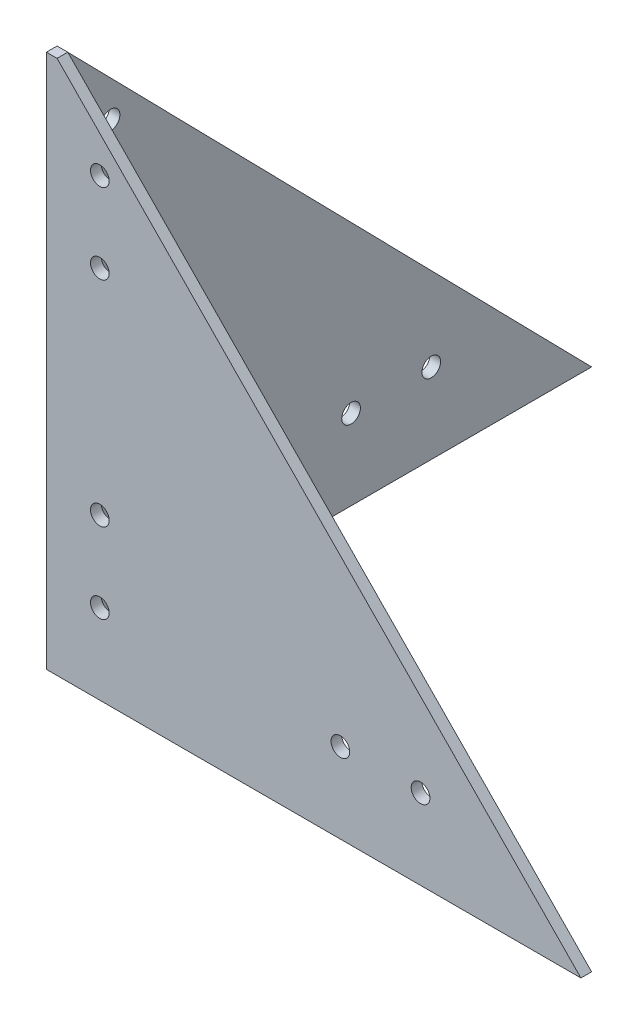
ISO-10303-21;
HEADER;
FILE_DESCRIPTION(('STEP AP214'),'2;1');
FILE_NAME('part.step','',(''),(''),'','','');
FILE_SCHEMA(('AUTOMOTIVE_DESIGN { 1 0 10303 214 1 1 1 1 }'));
ENDSEC;
DATA;
#1=APPLICATION_CONTEXT('core data for automotive mechanical design processes');
#2=APPLICATION_PROTOCOL_DEFINITION('international standard','automotive_design',2000,#1);
#3=PRODUCT_CONTEXT('',#1,'mechanical');
#4=PRODUCT('Part','Part','',(#3));
#5=PRODUCT_RELATED_PRODUCT_CATEGORY('part','',(#4));
#6=PRODUCT_DEFINITION_FORMATION('','',#4);
#7=PRODUCT_DEFINITION_CONTEXT('part definition',#1,'design');
#8=PRODUCT_DEFINITION('design','',#6,#7);
#9=PRODUCT_DEFINITION_SHAPE('','',#8);
#10=(LENGTH_UNIT() NAMED_UNIT(*) SI_UNIT(.MILLI.,.METRE.));
#11=(NAMED_UNIT(*) PLANE_ANGLE_UNIT() SI_UNIT($,.RADIAN.));
#12=(NAMED_UNIT(*) SI_UNIT($,.STERADIAN.) SOLID_ANGLE_UNIT());
#13=UNCERTAINTY_MEASURE_WITH_UNIT(LENGTH_MEASURE(1.E-05),#10,'distance_accuracy_value','');
#14=(GEOMETRIC_REPRESENTATION_CONTEXT(3) GLOBAL_UNCERTAINTY_ASSIGNED_CONTEXT((#13)) GLOBAL_UNIT_ASSIGNED_CONTEXT((#10,
#11,#12)) REPRESENTATION_CONTEXT('',''));
#15=CARTESIAN_POINT('',(0.,0.,0.));
#16=DIRECTION('',(0.,0.,1.));
#17=DIRECTION('',(1.,0.,0.));
#18=AXIS2_PLACEMENT_3D('',#15,#16,#17);
#19=CARTESIAN_POINT('',(0.,100.,0.));
#20=DIRECTION('',(1.,0.,0.));
#21=DIRECTION('',(0.,0.,-1.));
#22=AXIS2_PLACEMENT_3D('',#19,#20,#21);
#23=PLANE('',#22);
#24=CARTESIAN_POINT('',(0.,15.,-70.));
#25=DIRECTION('',(-1.,0.,0.));
#26=DIRECTION('',(0.,0.,1.));
#27=AXIS2_PLACEMENT_3D('',#24,#25,#26);
#28=CIRCLE('',#27,1.75);
#29=CARTESIAN_POINT('',(0.,15.,-68.25));
#30=VERTEX_POINT('',#29);
#31=EDGE_CURVE('E128',#30,#30,#28,.T.);
#32=ORIENTED_EDGE('',*,*,#31,.F.);
#33=EDGE_LOOP('',(#32));
#34=FACE_BOUND('',#33,.T.);
#35=CARTESIAN_POINT('',(0.,30.,-10.));
#36=DIRECTION('',(-1.,0.,0.));
#37=DIRECTION('',(0.,0.,1.));
#38=AXIS2_PLACEMENT_3D('',#35,#36,#37);
#39=CIRCLE('',#38,1.75);
#40=CARTESIAN_POINT('',(0.,30.,-8.25));
#41=VERTEX_POINT('',#40);
#42=EDGE_CURVE('E143',#41,#41,#39,.T.);
#43=ORIENTED_EDGE('',*,*,#42,.F.);
#44=EDGE_LOOP('',(#43));
#45=FACE_BOUND('',#44,.T.);
#46=CARTESIAN_POINT('',(0.,85.,-10.));
#47=DIRECTION('',(-1.,0.,0.));
#48=DIRECTION('',(0.,0.,1.));
#49=AXIS2_PLACEMENT_3D('',#46,#47,#48);
#50=CIRCLE('',#49,1.75);
#51=CARTESIAN_POINT('',(0.,85.,-8.25));
#52=VERTEX_POINT('',#51);
#53=EDGE_CURVE('E136',#52,#52,#50,.T.);
#54=ORIENTED_EDGE('',*,*,#53,.F.);
#55=EDGE_LOOP('',(#54));
#56=FACE_BOUND('',#55,.T.);
#57=CARTESIAN_POINT('',(0.,70.,-10.));
#58=DIRECTION('',(-1.,0.,0.));
#59=DIRECTION('',(0.,0.,1.));
#60=AXIS2_PLACEMENT_3D('',#57,#58,#59);
#61=CIRCLE('',#60,1.75);
#62=CARTESIAN_POINT('',(0.,70.,-8.25));
#63=VERTEX_POINT('',#62);
#64=EDGE_CURVE('E153',#63,#63,#61,.T.);
#65=ORIENTED_EDGE('',*,*,#64,.F.);
#66=EDGE_LOOP('',(#65));
#67=FACE_BOUND('',#66,.T.);
#68=CARTESIAN_POINT('',(0.,15.,-55.));
#69=DIRECTION('',(-1.,0.,0.));
#70=DIRECTION('',(0.,0.,1.));
#71=AXIS2_PLACEMENT_3D('',#68,#69,#70);
#72=CIRCLE('',#71,1.75);
#73=CARTESIAN_POINT('',(0.,15.,-53.25));
#74=VERTEX_POINT('',#73);
#75=EDGE_CURVE('E135',#74,#74,#72,.T.);
#76=ORIENTED_EDGE('',*,*,#75,.F.);
#77=EDGE_LOOP('',(#76));
#78=FACE_BOUND('',#77,.T.);
#79=CARTESIAN_POINT('',(0.,15.,-10.));
#80=DIRECTION('',(-1.,0.,0.));
#81=DIRECTION('',(0.,0.,1.));
#82=AXIS2_PLACEMENT_3D('',#79,#80,#81);
#83=CIRCLE('',#82,1.75);
#84=CARTESIAN_POINT('',(0.,15.,-8.25));
#85=VERTEX_POINT('',#84);
#86=EDGE_CURVE('E122',#85,#85,#83,.T.);
#87=ORIENTED_EDGE('',*,*,#86,.F.);
#88=EDGE_LOOP('',(#87));
#89=FACE_BOUND('',#88,.T.);
#90=DIRECTION('',(0.,0.,1.));
#91=VECTOR('',#90,1.);
#92=CARTESIAN_POINT('',(0.,0.,0.));
#93=LINE('',#92,#91);
#94=CARTESIAN_POINT('',(0.,0.,-100.));
#95=VERTEX_POINT('',#94);
#96=CARTESIAN_POINT('',(0.,0.,0.));
#97=VERTEX_POINT('',#96);
#98=EDGE_CURVE('E101',#95,#97,#93,.T.);
#99=ORIENTED_EDGE('',*,*,#98,.T.);
#100=DIRECTION('',(0.,-1.,0.));
#101=VECTOR('',#100,1.);
#102=CARTESIAN_POINT('',(0.,100.,0.));
#103=LINE('',#102,#101);
#104=CARTESIAN_POINT('',(0.,100.,0.));
#105=VERTEX_POINT('',#104);
#106=EDGE_CURVE('E11',#105,#97,#103,.T.);
#107=ORIENTED_EDGE('',*,*,#106,.F.);
#108=DIRECTION('',(0.,0.,1.));
#109=VECTOR('',#108,1.);
#110=CARTESIAN_POINT('',(0.,100.,0.));
#111=LINE('',#110,#109);
#112=CARTESIAN_POINT('',(0.,100.,-2.));
#113=VERTEX_POINT('',#112);
#114=EDGE_CURVE('E96',#113,#105,#111,.T.);
#115=ORIENTED_EDGE('',*,*,#114,.F.);
#116=DIRECTION('',(0.,-0.714212839142507,-0.699928582359657));
#117=VECTOR('',#116,1.);
#118=CARTESIAN_POINT('',(0.,100.,-2.));
#119=LINE('',#118,#117);
#120=EDGE_CURVE('E91',#113,#95,#119,.T.);
#121=ORIENTED_EDGE('',*,*,#120,.T.);
#122=EDGE_LOOP('',(#99,#107,#115,#121));
#123=FACE_BOUND('',#122,.T.);
#124=ADVANCED_FACE('F35',(#34,#45,#56,#67,#78,#89,#123),#23,.F.);
#125=CARTESIAN_POINT('',(0.,100.,0.));
#126=DIRECTION('',(0.,0.,-1.));
#127=DIRECTION('',(-1.,0.,0.));
#128=AXIS2_PLACEMENT_3D('',#125,#126,#127);
#129=PLANE('',#128);
#130=CARTESIAN_POINT('',(70.,15.,0.));
#131=DIRECTION('',(0.,0.,1.));
#132=DIRECTION('',(1.,0.,0.));
#133=AXIS2_PLACEMENT_3D('',#130,#131,#132);
#134=CIRCLE('',#133,1.75);
#135=CARTESIAN_POINT('',(71.75,15.,0.));
#136=VERTEX_POINT('',#135);
#137=EDGE_CURVE('E176',#136,#136,#134,.T.);
#138=ORIENTED_EDGE('',*,*,#137,.F.);
#139=EDGE_LOOP('',(#138));
#140=FACE_BOUND('',#139,.T.);
#141=CARTESIAN_POINT('',(10.,70.,0.));
#142=DIRECTION('',(0.,0.,1.));
#143=DIRECTION('',(1.,0.,0.));
#144=AXIS2_PLACEMENT_3D('',#141,#142,#143);
#145=CIRCLE('',#144,1.75000000000004);
#146=CARTESIAN_POINT('',(11.75,70.,0.));
#147=VERTEX_POINT('',#146);
#148=EDGE_CURVE('E183',#147,#147,#145,.T.);
#149=ORIENTED_EDGE('',*,*,#148,.F.);
#150=EDGE_LOOP('',(#149));
#151=FACE_BOUND('',#150,.T.);
#152=CARTESIAN_POINT('',(10.,85.,0.));
#153=DIRECTION('',(0.,0.,1.));
#154=DIRECTION('',(1.,0.,0.));
#155=AXIS2_PLACEMENT_3D('',#152,#153,#154);
#156=CIRCLE('',#155,1.75000000000004);
#157=CARTESIAN_POINT('',(11.75,85.,0.));
#158=VERTEX_POINT('',#157);
#159=EDGE_CURVE('E164',#158,#158,#156,.T.);
#160=ORIENTED_EDGE('',*,*,#159,.F.);
#161=EDGE_LOOP('',(#160));
#162=FACE_BOUND('',#161,.T.);
#163=CARTESIAN_POINT('',(10.,30.,0.));
#164=DIRECTION('',(0.,0.,1.));
#165=DIRECTION('',(1.,0.,0.));
#166=AXIS2_PLACEMENT_3D('',#163,#164,#165);
#167=CIRCLE('',#166,1.75000000000005);
#168=CARTESIAN_POINT('',(11.7500000000001,30.,0.));
#169=VERTEX_POINT('',#168);
#170=EDGE_CURVE('E171',#169,#169,#167,.T.);
#171=ORIENTED_EDGE('',*,*,#170,.F.);
#172=EDGE_LOOP('',(#171));
#173=FACE_BOUND('',#172,.T.);
#174=CARTESIAN_POINT('',(55.,15.,0.));
#175=DIRECTION('',(0.,0.,1.));
#176=DIRECTION('',(1.,0.,0.));
#177=AXIS2_PLACEMENT_3D('',#174,#175,#176);
#178=CIRCLE('',#177,1.74999999999999);
#179=CARTESIAN_POINT('',(56.75,15.,0.));
#180=VERTEX_POINT('',#179);
#181=EDGE_CURVE('E188',#180,#180,#178,.T.);
#182=ORIENTED_EDGE('',*,*,#181,.F.);
#183=EDGE_LOOP('',(#182));
#184=FACE_BOUND('',#183,.T.);
#185=CARTESIAN_POINT('',(10.,15.,0.));
#186=DIRECTION('',(0.,0.,1.));
#187=DIRECTION('',(1.,0.,0.));
#188=AXIS2_PLACEMENT_3D('',#185,#186,#187);
#189=CIRCLE('',#188,1.75000000000004);
#190=CARTESIAN_POINT('',(11.75,15.,0.));
#191=VERTEX_POINT('',#190);
#192=EDGE_CURVE('E158',#191,#191,#189,.T.);
#193=ORIENTED_EDGE('',*,*,#192,.F.);
#194=EDGE_LOOP('',(#193));
#195=FACE_BOUND('',#194,.T.);
#196=DIRECTION('',(1.,0.,0.));
#197=VECTOR('',#196,1.);
#198=CARTESIAN_POINT('',(0.,0.,0.));
#199=LINE('',#198,#197);
#200=CARTESIAN_POINT('',(100.,0.,0.));
#201=VERTEX_POINT('',#200);
#202=EDGE_CURVE('E97',#97,#201,#199,.T.);
#203=ORIENTED_EDGE('',*,*,#202,.T.);
#204=DIRECTION('',(-0.699928582359657,0.714212839142507,0.));
#205=VECTOR('',#204,1.);
#206=CARTESIAN_POINT('',(100.,0.,0.));
#207=LINE('',#206,#205);
#208=CARTESIAN_POINT('',(2.,100.,0.));
#209=VERTEX_POINT('',#208);
#210=EDGE_CURVE('E113',#201,#209,#207,.T.);
#211=ORIENTED_EDGE('',*,*,#210,.T.);
#212=DIRECTION('',(1.,0.,0.));
#213=VECTOR('',#212,1.);
#214=CARTESIAN_POINT('',(0.,100.,0.));
#215=LINE('',#214,#213);
#216=EDGE_CURVE('E99',#105,#209,#215,.T.);
#217=ORIENTED_EDGE('',*,*,#216,.F.);
#218=ORIENTED_EDGE('',*,*,#106,.T.);
#219=EDGE_LOOP('',(#203,#211,#217,#218));
#220=FACE_BOUND('',#219,.T.);
#221=ADVANCED_FACE('F204',(#140,#151,#162,#173,#184,#195,#220),#129,.F.);
#222=CARTESIAN_POINT('',(0.,100.,-2.));
#223=DIRECTION('',(0.,0.,1.));
#224=DIRECTION('',(1.,0.,0.));
#225=AXIS2_PLACEMENT_3D('',#222,#223,#224);
#226=PLANE('',#225);
#227=CARTESIAN_POINT('',(70.,15.,-2.));
#228=DIRECTION('',(0.,0.,1.));
#229=DIRECTION('',(1.,0.,0.));
#230=AXIS2_PLACEMENT_3D('',#227,#228,#229);
#231=CIRCLE('',#230,1.75);
#232=CARTESIAN_POINT('',(71.75,15.,-2.));
#233=VERTEX_POINT('',#232);
#234=EDGE_CURVE('E179',#233,#233,#231,.T.);
#235=ORIENTED_EDGE('',*,*,#234,.T.);
#236=EDGE_LOOP('',(#235));
#237=FACE_BOUND('',#236,.T.);
#238=CARTESIAN_POINT('',(10.,70.,-2.));
#239=DIRECTION('',(0.,0.,1.));
#240=DIRECTION('',(1.,0.,0.));
#241=AXIS2_PLACEMENT_3D('',#238,#239,#240);
#242=CIRCLE('',#241,1.75000000000004);
#243=CARTESIAN_POINT('',(11.75,70.,-2.));
#244=VERTEX_POINT('',#243);
#245=EDGE_CURVE('E168',#244,#244,#242,.T.);
#246=ORIENTED_EDGE('',*,*,#245,.T.);
#247=EDGE_LOOP('',(#246));
#248=FACE_BOUND('',#247,.T.);
#249=CARTESIAN_POINT('',(10.,85.,-2.));
#250=DIRECTION('',(0.,0.,1.));
#251=DIRECTION('',(1.,0.,0.));
#252=AXIS2_PLACEMENT_3D('',#249,#250,#251);
#253=CIRCLE('',#252,1.75000000000004);
#254=CARTESIAN_POINT('',(11.75,85.,-2.));
#255=VERTEX_POINT('',#254);
#256=EDGE_CURVE('E167',#255,#255,#253,.T.);
#257=ORIENTED_EDGE('',*,*,#256,.T.);
#258=EDGE_LOOP('',(#257));
#259=FACE_BOUND('',#258,.T.);
#260=CARTESIAN_POINT('',(10.,30.,-2.));
#261=DIRECTION('',(0.,0.,1.));
#262=DIRECTION('',(1.,0.,0.));
#263=AXIS2_PLACEMENT_3D('',#260,#261,#262);
#264=CIRCLE('',#263,1.75000000000005);
#265=CARTESIAN_POINT('',(11.7500000000001,30.,-2.));
#266=VERTEX_POINT('',#265);
#267=EDGE_CURVE('E161',#266,#266,#264,.T.);
#268=ORIENTED_EDGE('',*,*,#267,.T.);
#269=EDGE_LOOP('',(#268));
#270=FACE_BOUND('',#269,.T.);
#271=CARTESIAN_POINT('',(55.,15.,-2.));
#272=DIRECTION('',(0.,0.,1.));
#273=DIRECTION('',(1.,0.,0.));
#274=AXIS2_PLACEMENT_3D('',#271,#272,#273);
#275=CIRCLE('',#274,1.74999999999999);
#276=CARTESIAN_POINT('',(56.75,15.,-2.));
#277=VERTEX_POINT('',#276);
#278=EDGE_CURVE('E180',#277,#277,#275,.T.);
#279=ORIENTED_EDGE('',*,*,#278,.T.);
#280=EDGE_LOOP('',(#279));
#281=FACE_BOUND('',#280,.T.);
#282=CARTESIAN_POINT('',(10.,15.,-2.));
#283=DIRECTION('',(0.,0.,1.));
#284=DIRECTION('',(1.,0.,0.));
#285=AXIS2_PLACEMENT_3D('',#282,#283,#284);
#286=CIRCLE('',#285,1.75000000000004);
#287=CARTESIAN_POINT('',(11.75,15.,-2.));
#288=VERTEX_POINT('',#287);
#289=EDGE_CURVE('E132',#288,#288,#286,.T.);
#290=ORIENTED_EDGE('',*,*,#289,.T.);
#291=EDGE_LOOP('',(#290));
#292=FACE_BOUND('',#291,.T.);
#293=DIRECTION('',(-1.,0.,0.));
#294=VECTOR('',#293,1.);
#295=CARTESIAN_POINT('',(0.,0.,-2.));
#296=LINE('',#295,#294);
#297=CARTESIAN_POINT('',(100.,0.,-2.));
#298=VERTEX_POINT('',#297);
#299=CARTESIAN_POINT('',(2.,0.,-2.));
#300=VERTEX_POINT('',#299);
#301=EDGE_CURVE('E87',#298,#300,#296,.T.);
#302=ORIENTED_EDGE('',*,*,#301,.T.);
#303=DIRECTION('',(0.,1.,0.));
#304=VECTOR('',#303,1.);
#305=CARTESIAN_POINT('',(2.,0.,-2.));
#306=LINE('',#305,#304);
#307=CARTESIAN_POINT('',(2.,100.,-2.));
#308=VERTEX_POINT('',#307);
#309=EDGE_CURVE('E75',#300,#308,#306,.T.);
#310=ORIENTED_EDGE('',*,*,#309,.T.);
#311=DIRECTION('',(-0.699928582359657,0.714212839142507,0.));
#312=VECTOR('',#311,1.);
#313=CARTESIAN_POINT('',(100.,0.,-2.));
#314=LINE('',#313,#312);
#315=EDGE_CURVE('E95',#298,#308,#314,.T.);
#316=ORIENTED_EDGE('',*,*,#315,.F.);
#317=EDGE_LOOP('',(#302,#310,#316));
#318=FACE_BOUND('',#317,.T.);
#319=ADVANCED_FACE('F93',(#237,#248,#259,#270,#281,#292,#318),#226,.F.);
#320=CARTESIAN_POINT('',(0.,100.,0.));
#321=DIRECTION('',(0.,-1.,0.));
#322=DIRECTION('',(0.,0.,-1.));
#323=AXIS2_PLACEMENT_3D('',#320,#321,#322);
#324=PLANE('',#323);
#325=ORIENTED_EDGE('',*,*,#114,.T.);
#326=ORIENTED_EDGE('',*,*,#216,.T.);
#327=DIRECTION('',(0.,0.,-1.));
#328=VECTOR('',#327,1.);
#329=CARTESIAN_POINT('',(2.,100.,0.));
#330=LINE('',#329,#328);
#331=EDGE_CURVE('E109',#209,#308,#330,.T.);
#332=ORIENTED_EDGE('',*,*,#331,.T.);
#333=DIRECTION('',(-1.,0.,0.));
#334=VECTOR('',#333,1.);
#335=CARTESIAN_POINT('',(0.,100.,-2.));
#336=LINE('',#335,#334);
#337=EDGE_CURVE('E43',#308,#113,#336,.T.);
#338=ORIENTED_EDGE('',*,*,#337,.T.);
#339=EDGE_LOOP('',(#325,#326,#332,#338));
#340=FACE_BOUND('',#339,.T.);
#341=ADVANCED_FACE('F217',(#340),#324,.F.);
#342=CARTESIAN_POINT('',(0.,0.,0.));
#343=DIRECTION('',(0.,-1.,0.));
#344=DIRECTION('',(0.,0.,-1.));
#345=AXIS2_PLACEMENT_3D('',#342,#343,#344);
#346=PLANE('',#345);
#347=ORIENTED_EDGE('',*,*,#98,.F.);
#348=DIRECTION('',(-1.,0.,0.));
#349=VECTOR('',#348,1.);
#350=CARTESIAN_POINT('',(2.,0.,-100.));
#351=LINE('',#350,#349);
#352=CARTESIAN_POINT('',(2.,0.,-100.));
#353=VERTEX_POINT('',#352);
#354=EDGE_CURVE('E90',#353,#95,#351,.T.);
#355=ORIENTED_EDGE('',*,*,#354,.F.);
#356=DIRECTION('',(0.,0.,1.));
#357=VECTOR('',#356,1.);
#358=CARTESIAN_POINT('',(2.,0.,-100.));
#359=LINE('',#358,#357);
#360=EDGE_CURVE('E78',#353,#300,#359,.T.);
#361=ORIENTED_EDGE('',*,*,#360,.T.);
#362=ORIENTED_EDGE('',*,*,#301,.F.);
#363=DIRECTION('',(0.,0.,1.));
#364=VECTOR('',#363,1.);
#365=CARTESIAN_POINT('',(100.,0.,-2.));
#366=LINE('',#365,#364);
#367=EDGE_CURVE('E106',#298,#201,#366,.T.);
#368=ORIENTED_EDGE('',*,*,#367,.T.);
#369=ORIENTED_EDGE('',*,*,#202,.F.);
#370=EDGE_LOOP('',(#347,#355,#361,#362,#368,#369));
#371=FACE_BOUND('',#370,.T.);
#372=ADVANCED_FACE('F85',(#371),#346,.T.);
#373=CARTESIAN_POINT('',(100.,0.,-2.));
#374=DIRECTION('',(0.714212839142507,0.699928582359657,0.));
#375=DIRECTION('',(-0.699928582359657,0.714212839142507,0.));
#376=AXIS2_PLACEMENT_3D('',#373,#374,#375);
#377=PLANE('',#376);
#378=ORIENTED_EDGE('',*,*,#210,.F.);
#379=ORIENTED_EDGE('',*,*,#367,.F.);
#380=ORIENTED_EDGE('',*,*,#315,.T.);
#381=ORIENTED_EDGE('',*,*,#331,.F.);
#382=EDGE_LOOP('',(#378,#379,#380,#381));
#383=FACE_BOUND('',#382,.T.);
#384=ADVANCED_FACE('F215',(#383),#377,.T.);
#385=CARTESIAN_POINT('',(2.,100.,-2.));
#386=DIRECTION('',(0.,0.699928582359657,-0.714212839142507));
#387=DIRECTION('',(0.,0.714212839142507,0.699928582359657));
#388=AXIS2_PLACEMENT_3D('',#385,#386,#387);
#389=PLANE('',#388);
#390=ORIENTED_EDGE('',*,*,#120,.F.);
#391=ORIENTED_EDGE('',*,*,#337,.F.);
#392=DIRECTION('',(0.,-0.714212839142507,-0.699928582359657));
#393=VECTOR('',#392,1.);
#394=CARTESIAN_POINT('',(2.,100.,-2.));
#395=LINE('',#394,#393);
#396=EDGE_CURVE('E50',#308,#353,#395,.T.);
#397=ORIENTED_EDGE('',*,*,#396,.T.);
#398=ORIENTED_EDGE('',*,*,#354,.T.);
#399=EDGE_LOOP('',(#390,#391,#397,#398));
#400=FACE_BOUND('',#399,.T.);
#401=ADVANCED_FACE('F221',(#400),#389,.T.);
#402=CARTESIAN_POINT('',(2.,0.,0.));
#403=DIRECTION('',(-1.,0.,0.));
#404=DIRECTION('',(0.,0.,1.));
#405=AXIS2_PLACEMENT_3D('',#402,#403,#404);
#406=PLANE('',#405);
#407=CARTESIAN_POINT('',(2.,15.,-70.));
#408=DIRECTION('',(-1.,0.,0.));
#409=DIRECTION('',(0.,0.,1.));
#410=AXIS2_PLACEMENT_3D('',#407,#408,#409);
#411=CIRCLE('',#410,1.75);
#412=CARTESIAN_POINT('',(2.,15.,-68.25));
#413=VERTEX_POINT('',#412);
#414=EDGE_CURVE('E131',#413,#413,#411,.T.);
#415=ORIENTED_EDGE('',*,*,#414,.T.);
#416=EDGE_LOOP('',(#415));
#417=FACE_BOUND('',#416,.T.);
#418=CARTESIAN_POINT('',(2.,30.,-10.));
#419=DIRECTION('',(-1.,0.,0.));
#420=DIRECTION('',(0.,0.,1.));
#421=AXIS2_PLACEMENT_3D('',#418,#419,#420);
#422=CIRCLE('',#421,1.75);
#423=CARTESIAN_POINT('',(2.,30.,-8.25));
#424=VERTEX_POINT('',#423);
#425=EDGE_CURVE('E125',#424,#424,#422,.T.);
#426=ORIENTED_EDGE('',*,*,#425,.T.);
#427=EDGE_LOOP('',(#426));
#428=FACE_BOUND('',#427,.T.);
#429=CARTESIAN_POINT('',(2.,85.,-10.));
#430=DIRECTION('',(-1.,0.,0.));
#431=DIRECTION('',(0.,0.,1.));
#432=AXIS2_PLACEMENT_3D('',#429,#430,#431);
#433=CIRCLE('',#432,1.75);
#434=CARTESIAN_POINT('',(2.,85.,-8.25));
#435=VERTEX_POINT('',#434);
#436=EDGE_CURVE('E139',#435,#435,#433,.T.);
#437=ORIENTED_EDGE('',*,*,#436,.T.);
#438=EDGE_LOOP('',(#437));
#439=FACE_BOUND('',#438,.T.);
#440=CARTESIAN_POINT('',(2.,70.,-10.));
#441=DIRECTION('',(-1.,0.,0.));
#442=DIRECTION('',(0.,0.,1.));
#443=AXIS2_PLACEMENT_3D('',#440,#441,#442);
#444=CIRCLE('',#443,1.75);
#445=CARTESIAN_POINT('',(2.,70.,-8.25));
#446=VERTEX_POINT('',#445);
#447=EDGE_CURVE('E140',#446,#446,#444,.T.);
#448=ORIENTED_EDGE('',*,*,#447,.T.);
#449=EDGE_LOOP('',(#448));
#450=FACE_BOUND('',#449,.T.);
#451=CARTESIAN_POINT('',(2.,15.,-55.));
#452=DIRECTION('',(-1.,0.,0.));
#453=DIRECTION('',(0.,0.,1.));
#454=AXIS2_PLACEMENT_3D('',#451,#452,#453);
#455=CIRCLE('',#454,1.75);
#456=CARTESIAN_POINT('',(2.,15.,-53.25));
#457=VERTEX_POINT('',#456);
#458=EDGE_CURVE('E150',#457,#457,#455,.T.);
#459=ORIENTED_EDGE('',*,*,#458,.T.);
#460=EDGE_LOOP('',(#459));
#461=FACE_BOUND('',#460,.T.);
#462=CARTESIAN_POINT('',(2.,15.,-10.));
#463=DIRECTION('',(-1.,0.,0.));
#464=DIRECTION('',(0.,0.,1.));
#465=AXIS2_PLACEMENT_3D('',#462,#463,#464);
#466=CIRCLE('',#465,1.75);
#467=CARTESIAN_POINT('',(2.,15.,-8.25));
#468=VERTEX_POINT('',#467);
#469=EDGE_CURVE('E120',#468,#468,#466,.T.);
#470=ORIENTED_EDGE('',*,*,#469,.T.);
#471=EDGE_LOOP('',(#470));
#472=FACE_BOUND('',#471,.T.);
#473=ORIENTED_EDGE('',*,*,#360,.F.);
#474=ORIENTED_EDGE('',*,*,#396,.F.);
#475=ORIENTED_EDGE('',*,*,#309,.F.);
#476=EDGE_LOOP('',(#473,#474,#475));
#477=FACE_BOUND('',#476,.T.);
#478=ADVANCED_FACE('F77',(#417,#428,#439,#450,#461,#472,#477),#406,.F.);
#479=CARTESIAN_POINT('',(2.,15.,-10.));
#480=DIRECTION('',(-1.,0.,0.));
#481=DIRECTION('',(0.,0.,1.));
#482=AXIS2_PLACEMENT_3D('',#479,#480,#481);
#483=CYLINDRICAL_SURFACE('',#482,1.75);
#484=ORIENTED_EDGE('',*,*,#469,.F.);
#485=EDGE_LOOP('',(#484));
#486=FACE_BOUND('',#485,.T.);
#487=ORIENTED_EDGE('',*,*,#86,.T.);
#488=EDGE_LOOP('',(#487));
#489=FACE_BOUND('',#488,.T.);
#490=ADVANCED_FACE('F228',(#486,#489),#483,.F.);
#491=CARTESIAN_POINT('',(2.,15.,-55.));
#492=DIRECTION('',(-1.,0.,0.));
#493=DIRECTION('',(0.,0.,1.));
#494=AXIS2_PLACEMENT_3D('',#491,#492,#493);
#495=CYLINDRICAL_SURFACE('',#494,1.75);
#496=ORIENTED_EDGE('',*,*,#458,.F.);
#497=EDGE_LOOP('',(#496));
#498=FACE_BOUND('',#497,.T.);
#499=ORIENTED_EDGE('',*,*,#75,.T.);
#500=EDGE_LOOP('',(#499));
#501=FACE_BOUND('',#500,.T.);
#502=ADVANCED_FACE('F249',(#498,#501),#495,.F.);
#503=CARTESIAN_POINT('',(2.,70.,-10.));
#504=DIRECTION('',(-1.,0.,0.));
#505=DIRECTION('',(0.,0.,1.));
#506=AXIS2_PLACEMENT_3D('',#503,#504,#505);
#507=CYLINDRICAL_SURFACE('',#506,1.75);
#508=ORIENTED_EDGE('',*,*,#447,.F.);
#509=EDGE_LOOP('',(#508));
#510=FACE_BOUND('',#509,.T.);
#511=ORIENTED_EDGE('',*,*,#64,.T.);
#512=EDGE_LOOP('',(#511));
#513=FACE_BOUND('',#512,.T.);
#514=ADVANCED_FACE('F255',(#510,#513),#507,.F.);
#515=CARTESIAN_POINT('',(2.,85.,-10.));
#516=DIRECTION('',(-1.,0.,0.));
#517=DIRECTION('',(0.,0.,1.));
#518=AXIS2_PLACEMENT_3D('',#515,#516,#517);
#519=CYLINDRICAL_SURFACE('',#518,1.75);
#520=ORIENTED_EDGE('',*,*,#436,.F.);
#521=EDGE_LOOP('',(#520));
#522=FACE_BOUND('',#521,.T.);
#523=ORIENTED_EDGE('',*,*,#53,.T.);
#524=EDGE_LOOP('',(#523));
#525=FACE_BOUND('',#524,.T.);
#526=ADVANCED_FACE('F265',(#522,#525),#519,.F.);
#527=CARTESIAN_POINT('',(2.,30.,-10.));
#528=DIRECTION('',(-1.,0.,0.));
#529=DIRECTION('',(0.,0.,1.));
#530=AXIS2_PLACEMENT_3D('',#527,#528,#529);
#531=CYLINDRICAL_SURFACE('',#530,1.75);
#532=ORIENTED_EDGE('',*,*,#425,.F.);
#533=EDGE_LOOP('',(#532));
#534=FACE_BOUND('',#533,.T.);
#535=ORIENTED_EDGE('',*,*,#42,.T.);
#536=EDGE_LOOP('',(#535));
#537=FACE_BOUND('',#536,.T.);
#538=ADVANCED_FACE('F263',(#534,#537),#531,.F.);
#539=CARTESIAN_POINT('',(2.,15.,-70.));
#540=DIRECTION('',(-1.,0.,0.));
#541=DIRECTION('',(0.,0.,1.));
#542=AXIS2_PLACEMENT_3D('',#539,#540,#541);
#543=CYLINDRICAL_SURFACE('',#542,1.75);
#544=ORIENTED_EDGE('',*,*,#414,.F.);
#545=EDGE_LOOP('',(#544));
#546=FACE_BOUND('',#545,.T.);
#547=ORIENTED_EDGE('',*,*,#31,.T.);
#548=EDGE_LOOP('',(#547));
#549=FACE_BOUND('',#548,.T.);
#550=ADVANCED_FACE('F260',(#546,#549),#543,.F.);
#551=CARTESIAN_POINT('',(10.,15.,-2.));
#552=DIRECTION('',(0.,0.,1.));
#553=DIRECTION('',(1.,0.,0.));
#554=AXIS2_PLACEMENT_3D('',#551,#552,#553);
#555=CYLINDRICAL_SURFACE('',#554,1.75000000000004);
#556=ORIENTED_EDGE('',*,*,#289,.F.);
#557=EDGE_LOOP('',(#556));
#558=FACE_BOUND('',#557,.T.);
#559=ORIENTED_EDGE('',*,*,#192,.T.);
#560=EDGE_LOOP('',(#559));
#561=FACE_BOUND('',#560,.T.);
#562=ADVANCED_FACE('F200',(#558,#561),#555,.F.);
#563=CARTESIAN_POINT('',(55.,15.,-2.));
#564=DIRECTION('',(0.,0.,1.));
#565=DIRECTION('',(1.,0.,0.));
#566=AXIS2_PLACEMENT_3D('',#563,#564,#565);
#567=CYLINDRICAL_SURFACE('',#566,1.74999999999999);
#568=ORIENTED_EDGE('',*,*,#278,.F.);
#569=EDGE_LOOP('',(#568));
#570=FACE_BOUND('',#569,.T.);
#571=ORIENTED_EDGE('',*,*,#181,.T.);
#572=EDGE_LOOP('',(#571));
#573=FACE_BOUND('',#572,.T.);
#574=ADVANCED_FACE('F196',(#570,#573),#567,.F.);
#575=CARTESIAN_POINT('',(10.,30.,-2.));
#576=DIRECTION('',(0.,0.,1.));
#577=DIRECTION('',(1.,0.,0.));
#578=AXIS2_PLACEMENT_3D('',#575,#576,#577);
#579=CYLINDRICAL_SURFACE('',#578,1.75000000000005);
#580=ORIENTED_EDGE('',*,*,#267,.F.);
#581=EDGE_LOOP('',(#580));
#582=FACE_BOUND('',#581,.T.);
#583=ORIENTED_EDGE('',*,*,#170,.T.);
#584=EDGE_LOOP('',(#583));
#585=FACE_BOUND('',#584,.T.);
#586=ADVANCED_FACE('F199',(#582,#585),#579,.F.);
#587=CARTESIAN_POINT('',(10.,85.,-2.));
#588=DIRECTION('',(0.,0.,1.));
#589=DIRECTION('',(1.,0.,0.));
#590=AXIS2_PLACEMENT_3D('',#587,#588,#589);
#591=CYLINDRICAL_SURFACE('',#590,1.75000000000004);
#592=ORIENTED_EDGE('',*,*,#256,.F.);
#593=EDGE_LOOP('',(#592));
#594=FACE_BOUND('',#593,.T.);
#595=ORIENTED_EDGE('',*,*,#159,.T.);
#596=EDGE_LOOP('',(#595));
#597=FACE_BOUND('',#596,.T.);
#598=ADVANCED_FACE('F278',(#594,#597),#591,.F.);
#599=CARTESIAN_POINT('',(10.,70.,-2.));
#600=DIRECTION('',(0.,0.,1.));
#601=DIRECTION('',(1.,0.,0.));
#602=AXIS2_PLACEMENT_3D('',#599,#600,#601);
#603=CYLINDRICAL_SURFACE('',#602,1.75000000000004);
#604=ORIENTED_EDGE('',*,*,#245,.F.);
#605=EDGE_LOOP('',(#604));
#606=FACE_BOUND('',#605,.T.);
#607=ORIENTED_EDGE('',*,*,#148,.T.);
#608=EDGE_LOOP('',(#607));
#609=FACE_BOUND('',#608,.T.);
#610=ADVANCED_FACE('F281',(#606,#609),#603,.F.);
#611=CARTESIAN_POINT('',(70.,15.,-2.));
#612=DIRECTION('',(0.,0.,1.));
#613=DIRECTION('',(1.,0.,0.));
#614=AXIS2_PLACEMENT_3D('',#611,#612,#613);
#615=CYLINDRICAL_SURFACE('',#614,1.75);
#616=ORIENTED_EDGE('',*,*,#234,.F.);
#617=EDGE_LOOP('',(#616));
#618=FACE_BOUND('',#617,.T.);
#619=ORIENTED_EDGE('',*,*,#137,.T.);
#620=EDGE_LOOP('',(#619));
#621=FACE_BOUND('',#620,.T.);
#622=ADVANCED_FACE('F286',(#618,#621),#615,.F.);
#623=CLOSED_SHELL('',(#124,#221,#319,#341,#372,#384,#401,#478,#490,#502,#514,#526,#538,#550,
#562,#574,#586,#598,#610,#622));
#624=MANIFOLD_SOLID_BREP('B2',#623);
#625=ADVANCED_BREP_SHAPE_REPRESENTATION('',(#18,#624),#14);
#626=SHAPE_DEFINITION_REPRESENTATION(#9,#625);
ENDSEC;
END-ISO-10303-21;
